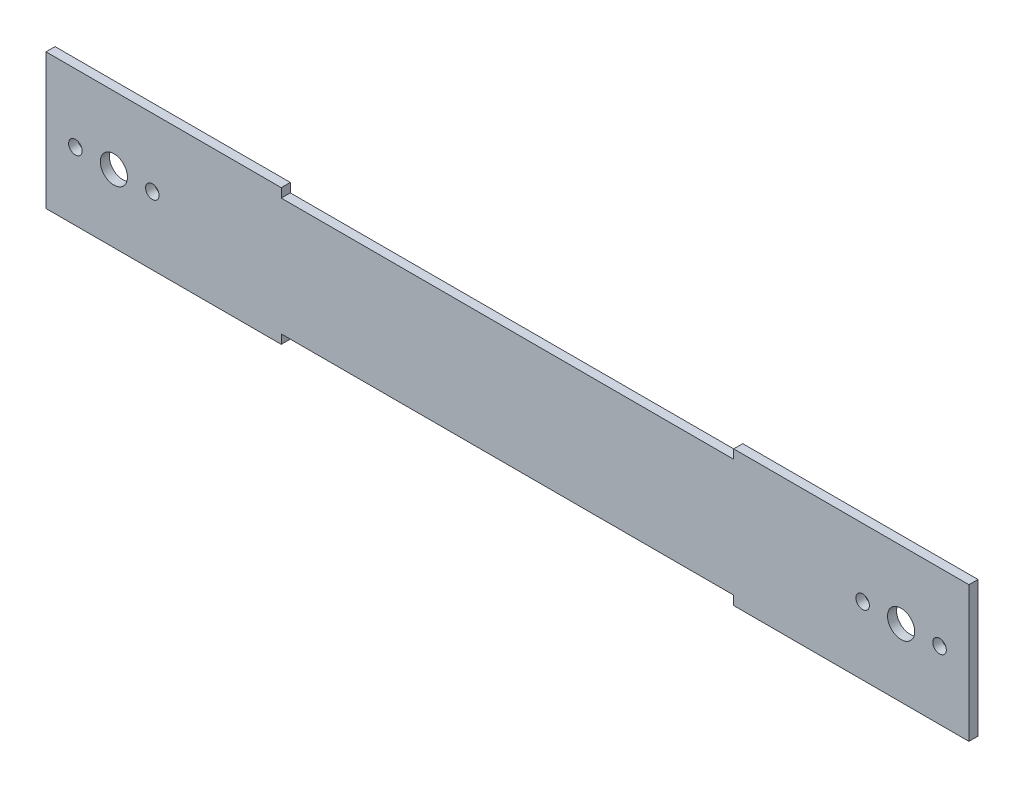
ISO-10303-21;
HEADER;
FILE_DESCRIPTION(('STEP AP214'),'2;1');
FILE_NAME('part.step','',(''),(''),'','','');
FILE_SCHEMA(('AUTOMOTIVE_DESIGN { 1 0 10303 214 1 1 1 1 }'));
ENDSEC;
DATA;
#1=APPLICATION_CONTEXT('core data for automotive mechanical design processes');
#2=APPLICATION_PROTOCOL_DEFINITION('international standard','automotive_design',2000,#1);
#3=PRODUCT_CONTEXT('',#1,'mechanical');
#4=PRODUCT('Part','Part','',(#3));
#5=PRODUCT_RELATED_PRODUCT_CATEGORY('part','',(#4));
#6=PRODUCT_DEFINITION_FORMATION('','',#4);
#7=PRODUCT_DEFINITION_CONTEXT('part definition',#1,'design');
#8=PRODUCT_DEFINITION('design','',#6,#7);
#9=PRODUCT_DEFINITION_SHAPE('','',#8);
#10=(LENGTH_UNIT() NAMED_UNIT(*) SI_UNIT(.MILLI.,.METRE.));
#11=(NAMED_UNIT(*) PLANE_ANGLE_UNIT() SI_UNIT($,.RADIAN.));
#12=(NAMED_UNIT(*) SI_UNIT($,.STERADIAN.) SOLID_ANGLE_UNIT());
#13=UNCERTAINTY_MEASURE_WITH_UNIT(LENGTH_MEASURE(1.E-05),#10,'distance_accuracy_value','');
#14=(GEOMETRIC_REPRESENTATION_CONTEXT(3) GLOBAL_UNCERTAINTY_ASSIGNED_CONTEXT((#13)) GLOBAL_UNIT_ASSIGNED_CONTEXT((#10,
#11,#12)) REPRESENTATION_CONTEXT('',''));
#15=CARTESIAN_POINT('',(0.,0.,0.));
#16=DIRECTION('',(0.,0.,1.));
#17=DIRECTION('',(1.,0.,0.));
#18=AXIS2_PLACEMENT_3D('',#15,#16,#17);
#19=CARTESIAN_POINT('',(0.,-15.,2.));
#20=DIRECTION('',(1.,0.,0.));
#21=DIRECTION('',(0.,1.,0.));
#22=AXIS2_PLACEMENT_3D('',#19,#20,#21);
#23=PLANE('',#22);
#24=DIRECTION('',(0.,-1.,0.));
#25=VECTOR('',#24,1.);
#26=CARTESIAN_POINT('',(0.,-15.,0.));
#27=LINE('',#26,#25);
#28=CARTESIAN_POINT('',(0.,15.,0.));
#29=VERTEX_POINT('',#28);
#30=CARTESIAN_POINT('',(0.,-15.,0.));
#31=VERTEX_POINT('',#30);
#32=EDGE_CURVE('E127',#29,#31,#27,.T.);
#33=ORIENTED_EDGE('',*,*,#32,.T.);
#34=DIRECTION('',(0.,0.,-1.));
#35=VECTOR('',#34,1.);
#36=CARTESIAN_POINT('',(0.,-15.,2.));
#37=LINE('',#36,#35);
#38=CARTESIAN_POINT('',(0.,-15.,2.));
#39=VERTEX_POINT('',#38);
#40=EDGE_CURVE('E11',#39,#31,#37,.T.);
#41=ORIENTED_EDGE('',*,*,#40,.F.);
#42=DIRECTION('',(0.,-1.,0.));
#43=VECTOR('',#42,1.);
#44=CARTESIAN_POINT('',(0.,-15.,2.));
#45=LINE('',#44,#43);
#46=CARTESIAN_POINT('',(0.,15.,2.));
#47=VERTEX_POINT('',#46);
#48=EDGE_CURVE('E90',#47,#39,#45,.T.);
#49=ORIENTED_EDGE('',*,*,#48,.F.);
#50=DIRECTION('',(0.,0.,-1.));
#51=VECTOR('',#50,1.);
#52=CARTESIAN_POINT('',(0.,15.,2.));
#53=LINE('',#52,#51);
#54=EDGE_CURVE('E186',#47,#29,#53,.T.);
#55=ORIENTED_EDGE('',*,*,#54,.T.);
#56=EDGE_LOOP('',(#33,#41,#49,#55));
#57=FACE_BOUND('',#56,.T.);
#58=ADVANCED_FACE('F36',(#57),#23,.F.);
#59=CARTESIAN_POINT('',(0.,-15.,2.));
#60=DIRECTION('',(0.,1.,0.));
#61=DIRECTION('',(-1.,0.,0.));
#62=AXIS2_PLACEMENT_3D('',#59,#60,#61);
#63=PLANE('',#62);
#64=DIRECTION('',(1.,0.,0.));
#65=VECTOR('',#64,1.);
#66=CARTESIAN_POINT('',(0.,-15.,0.));
#67=LINE('',#66,#65);
#68=CARTESIAN_POINT('',(52.,-15.,0.));
#69=VERTEX_POINT('',#68);
#70=EDGE_CURVE('E129',#31,#69,#67,.T.);
#71=ORIENTED_EDGE('',*,*,#70,.T.);
#72=DIRECTION('',(0.,0.,-1.));
#73=VECTOR('',#72,1.);
#74=CARTESIAN_POINT('',(52.,-15.,2.));
#75=LINE('',#74,#73);
#76=CARTESIAN_POINT('',(52.,-15.,2.));
#77=VERTEX_POINT('',#76);
#78=EDGE_CURVE('E44',#77,#69,#75,.T.);
#79=ORIENTED_EDGE('',*,*,#78,.F.);
#80=DIRECTION('',(1.,0.,0.));
#81=VECTOR('',#80,1.);
#82=CARTESIAN_POINT('',(0.,-15.,2.));
#83=LINE('',#82,#81);
#84=EDGE_CURVE('E181',#39,#77,#83,.T.);
#85=ORIENTED_EDGE('',*,*,#84,.F.);
#86=ORIENTED_EDGE('',*,*,#40,.T.);
#87=EDGE_LOOP('',(#71,#79,#85,#86));
#88=FACE_BOUND('',#87,.T.);
#89=ADVANCED_FACE('F182',(#88),#63,.F.);
#90=CARTESIAN_POINT('',(52.,-15.,2.));
#91=DIRECTION('',(-1.,0.,0.));
#92=DIRECTION('',(0.,0.,1.));
#93=AXIS2_PLACEMENT_3D('',#90,#91,#92);
#94=PLANE('',#93);
#95=DIRECTION('',(0.,1.,0.));
#96=VECTOR('',#95,1.);
#97=CARTESIAN_POINT('',(52.,-15.,0.));
#98=LINE('',#97,#96);
#99=CARTESIAN_POINT('',(52.,-13.,0.));
#100=VERTEX_POINT('',#99);
#101=EDGE_CURVE('E132',#69,#100,#98,.T.);
#102=ORIENTED_EDGE('',*,*,#101,.T.);
#103=DIRECTION('',(0.,0.,-1.));
#104=VECTOR('',#103,1.);
#105=CARTESIAN_POINT('',(52.,-13.,2.));
#106=LINE('',#105,#104);
#107=CARTESIAN_POINT('',(52.,-13.,2.));
#108=VERTEX_POINT('',#107);
#109=EDGE_CURVE('E116',#108,#100,#106,.T.);
#110=ORIENTED_EDGE('',*,*,#109,.F.);
#111=DIRECTION('',(0.,1.,0.));
#112=VECTOR('',#111,1.);
#113=CARTESIAN_POINT('',(52.,-15.,2.));
#114=LINE('',#113,#112);
#115=EDGE_CURVE('E107',#77,#108,#114,.T.);
#116=ORIENTED_EDGE('',*,*,#115,.F.);
#117=ORIENTED_EDGE('',*,*,#78,.T.);
#118=EDGE_LOOP('',(#102,#110,#116,#117));
#119=FACE_BOUND('',#118,.T.);
#120=ADVANCED_FACE('F146',(#119),#94,.F.);
#121=CARTESIAN_POINT('',(52.,-13.,2.));
#122=DIRECTION('',(0.,1.,0.));
#123=DIRECTION('',(0.,0.,1.));
#124=AXIS2_PLACEMENT_3D('',#121,#122,#123);
#125=PLANE('',#124);
#126=DIRECTION('',(1.,0.,0.));
#127=VECTOR('',#126,1.);
#128=CARTESIAN_POINT('',(52.,-13.,0.));
#129=LINE('',#128,#127);
#130=CARTESIAN_POINT('',(152.,-13.,0.));
#131=VERTEX_POINT('',#130);
#132=EDGE_CURVE('E115',#100,#131,#129,.T.);
#133=ORIENTED_EDGE('',*,*,#132,.T.);
#134=DIRECTION('',(0.,0.,-1.));
#135=VECTOR('',#134,1.);
#136=CARTESIAN_POINT('',(152.,-13.,2.));
#137=LINE('',#136,#135);
#138=CARTESIAN_POINT('',(152.,-13.,2.));
#139=VERTEX_POINT('',#138);
#140=EDGE_CURVE('E112',#139,#131,#137,.T.);
#141=ORIENTED_EDGE('',*,*,#140,.F.);
#142=DIRECTION('',(1.,0.,0.));
#143=VECTOR('',#142,1.);
#144=CARTESIAN_POINT('',(52.,-13.,2.));
#145=LINE('',#144,#143);
#146=EDGE_CURVE('E101',#108,#139,#145,.T.);
#147=ORIENTED_EDGE('',*,*,#146,.F.);
#148=ORIENTED_EDGE('',*,*,#109,.T.);
#149=EDGE_LOOP('',(#133,#141,#147,#148));
#150=FACE_BOUND('',#149,.T.);
#151=ADVANCED_FACE('F113',(#150),#125,.F.);
#152=CARTESIAN_POINT('',(152.,-13.,2.));
#153=DIRECTION('',(1.,0.,0.));
#154=DIRECTION('',(0.,0.,-1.));
#155=AXIS2_PLACEMENT_3D('',#152,#153,#154);
#156=PLANE('',#155);
#157=DIRECTION('',(0.,-1.,0.));
#158=VECTOR('',#157,1.);
#159=CARTESIAN_POINT('',(152.,-13.,0.));
#160=LINE('',#159,#158);
#161=CARTESIAN_POINT('',(152.,-15.,0.));
#162=VERTEX_POINT('',#161);
#163=EDGE_CURVE('E76',#131,#162,#160,.T.);
#164=ORIENTED_EDGE('',*,*,#163,.T.);
#165=DIRECTION('',(0.,0.,-1.));
#166=VECTOR('',#165,1.);
#167=CARTESIAN_POINT('',(152.,-15.,2.));
#168=LINE('',#167,#166);
#169=CARTESIAN_POINT('',(152.,-15.,2.));
#170=VERTEX_POINT('',#169);
#171=EDGE_CURVE('E117',#170,#162,#168,.T.);
#172=ORIENTED_EDGE('',*,*,#171,.F.);
#173=DIRECTION('',(0.,-1.,0.));
#174=VECTOR('',#173,1.);
#175=CARTESIAN_POINT('',(152.,-13.,2.));
#176=LINE('',#175,#174);
#177=EDGE_CURVE('E105',#139,#170,#176,.T.);
#178=ORIENTED_EDGE('',*,*,#177,.F.);
#179=ORIENTED_EDGE('',*,*,#140,.T.);
#180=EDGE_LOOP('',(#164,#172,#178,#179));
#181=FACE_BOUND('',#180,.T.);
#182=ADVANCED_FACE('F119',(#181),#156,.F.);
#183=CARTESIAN_POINT('',(152.,-15.,2.));
#184=DIRECTION('',(0.,1.,0.));
#185=DIRECTION('',(0.,0.,1.));
#186=AXIS2_PLACEMENT_3D('',#183,#184,#185);
#187=PLANE('',#186);
#188=DIRECTION('',(1.,0.,0.));
#189=VECTOR('',#188,1.);
#190=CARTESIAN_POINT('',(152.,-15.,0.));
#191=LINE('',#190,#189);
#192=CARTESIAN_POINT('',(204.,-15.,0.));
#193=VERTEX_POINT('',#192);
#194=EDGE_CURVE('E82',#162,#193,#191,.T.);
#195=ORIENTED_EDGE('',*,*,#194,.T.);
#196=DIRECTION('',(0.,0.,-1.));
#197=VECTOR('',#196,1.);
#198=CARTESIAN_POINT('',(204.,-15.,2.));
#199=LINE('',#198,#197);
#200=CARTESIAN_POINT('',(204.,-15.,2.));
#201=VERTEX_POINT('',#200);
#202=EDGE_CURVE('E126',#201,#193,#199,.T.);
#203=ORIENTED_EDGE('',*,*,#202,.F.);
#204=DIRECTION('',(1.,0.,0.));
#205=VECTOR('',#204,1.);
#206=CARTESIAN_POINT('',(152.,-15.,2.));
#207=LINE('',#206,#205);
#208=EDGE_CURVE('E52',#170,#201,#207,.T.);
#209=ORIENTED_EDGE('',*,*,#208,.F.);
#210=ORIENTED_EDGE('',*,*,#171,.T.);
#211=EDGE_LOOP('',(#195,#203,#209,#210));
#212=FACE_BOUND('',#211,.T.);
#213=ADVANCED_FACE('F280',(#212),#187,.F.);
#214=CARTESIAN_POINT('',(204.,0.,2.));
#215=DIRECTION('',(-1.,0.,0.));
#216=DIRECTION('',(0.,0.,1.));
#217=AXIS2_PLACEMENT_3D('',#214,#215,#216);
#218=PLANE('',#217);
#219=DIRECTION('',(0.,1.,0.));
#220=VECTOR('',#219,1.);
#221=CARTESIAN_POINT('',(204.,0.,0.));
#222=LINE('',#221,#220);
#223=CARTESIAN_POINT('',(204.,15.,0.));
#224=VERTEX_POINT('',#223);
#225=EDGE_CURVE('E137',#193,#224,#222,.T.);
#226=ORIENTED_EDGE('',*,*,#225,.T.);
#227=DIRECTION('',(0.,0.,-1.));
#228=VECTOR('',#227,1.);
#229=CARTESIAN_POINT('',(204.,15.,2.));
#230=LINE('',#229,#228);
#231=CARTESIAN_POINT('',(204.,15.,2.));
#232=VERTEX_POINT('',#231);
#233=EDGE_CURVE('E130',#232,#224,#230,.T.);
#234=ORIENTED_EDGE('',*,*,#233,.F.);
#235=DIRECTION('',(0.,1.,0.));
#236=VECTOR('',#235,1.);
#237=CARTESIAN_POINT('',(204.,0.,2.));
#238=LINE('',#237,#236);
#239=EDGE_CURVE('E121',#201,#232,#238,.T.);
#240=ORIENTED_EDGE('',*,*,#239,.F.);
#241=ORIENTED_EDGE('',*,*,#202,.T.);
#242=EDGE_LOOP('',(#226,#234,#240,#241));
#243=FACE_BOUND('',#242,.T.);
#244=ADVANCED_FACE('F162',(#243),#218,.F.);
#245=CARTESIAN_POINT('',(0.,0.,2.));
#246=DIRECTION('',(0.,0.,-1.));
#247=DIRECTION('',(-1.,0.,0.));
#248=AXIS2_PLACEMENT_3D('',#245,#246,#247);
#249=PLANE('',#248);
#250=CARTESIAN_POINT('',(6.5,0.,2.));
#251=DIRECTION('',(0.,0.,1.));
#252=DIRECTION('',(1.,0.,0.));
#253=AXIS2_PLACEMENT_3D('',#250,#251,#252);
#254=CIRCLE('',#253,1.5);
#255=CARTESIAN_POINT('',(8.,0.,2.));
#256=VERTEX_POINT('',#255);
#257=EDGE_CURVE('E388',#256,#256,#254,.T.);
#258=ORIENTED_EDGE('',*,*,#257,.F.);
#259=EDGE_LOOP('',(#258));
#260=FACE_BOUND('',#259,.T.);
#261=CARTESIAN_POINT('',(15.,0.,2.));
#262=DIRECTION('',(0.,0.,1.));
#263=DIRECTION('',(1.,0.,0.));
#264=AXIS2_PLACEMENT_3D('',#261,#262,#263);
#265=CIRCLE('',#264,3.);
#266=CARTESIAN_POINT('',(18.,0.,2.));
#267=VERTEX_POINT('',#266);
#268=EDGE_CURVE('E393',#267,#267,#265,.T.);
#269=ORIENTED_EDGE('',*,*,#268,.F.);
#270=EDGE_LOOP('',(#269));
#271=FACE_BOUND('',#270,.T.);
#272=CARTESIAN_POINT('',(23.5,0.,2.));
#273=DIRECTION('',(0.,0.,1.));
#274=DIRECTION('',(1.,0.,0.));
#275=AXIS2_PLACEMENT_3D('',#272,#273,#274);
#276=CIRCLE('',#275,1.5);
#277=CARTESIAN_POINT('',(25.,0.,2.));
#278=VERTEX_POINT('',#277);
#279=EDGE_CURVE('E401',#278,#278,#276,.T.);
#280=ORIENTED_EDGE('',*,*,#279,.F.);
#281=EDGE_LOOP('',(#280));
#282=FACE_BOUND('',#281,.T.);
#283=CARTESIAN_POINT('',(180.5,0.,2.));
#284=DIRECTION('',(0.,0.,1.));
#285=DIRECTION('',(1.,0.,0.));
#286=AXIS2_PLACEMENT_3D('',#283,#284,#285);
#287=CIRCLE('',#286,1.5);
#288=CARTESIAN_POINT('',(182.,0.,2.));
#289=VERTEX_POINT('',#288);
#290=EDGE_CURVE('E407',#289,#289,#287,.T.);
#291=ORIENTED_EDGE('',*,*,#290,.F.);
#292=EDGE_LOOP('',(#291));
#293=FACE_BOUND('',#292,.T.);
#294=CARTESIAN_POINT('',(189.,0.,2.));
#295=DIRECTION('',(0.,0.,1.));
#296=DIRECTION('',(1.,0.,0.));
#297=AXIS2_PLACEMENT_3D('',#294,#295,#296);
#298=CIRCLE('',#297,2.99999999999999);
#299=CARTESIAN_POINT('',(192.,0.,2.));
#300=VERTEX_POINT('',#299);
#301=EDGE_CURVE('E413',#300,#300,#298,.T.);
#302=ORIENTED_EDGE('',*,*,#301,.F.);
#303=EDGE_LOOP('',(#302));
#304=FACE_BOUND('',#303,.T.);
#305=CARTESIAN_POINT('',(197.5,0.,2.));
#306=DIRECTION('',(0.,0.,1.));
#307=DIRECTION('',(1.,0.,0.));
#308=AXIS2_PLACEMENT_3D('',#305,#306,#307);
#309=CIRCLE('',#308,1.5);
#310=CARTESIAN_POINT('',(199.,0.,2.));
#311=VERTEX_POINT('',#310);
#312=EDGE_CURVE('E418',#311,#311,#309,.T.);
#313=ORIENTED_EDGE('',*,*,#312,.F.);
#314=EDGE_LOOP('',(#313));
#315=FACE_BOUND('',#314,.T.);
#316=ORIENTED_EDGE('',*,*,#239,.T.);
#317=DIRECTION('',(1.,0.,0.));
#318=VECTOR('',#317,1.);
#319=CARTESIAN_POINT('',(152.,15.,2.));
#320=LINE('',#319,#318);
#321=CARTESIAN_POINT('',(152.,15.,2.));
#322=VERTEX_POINT('',#321);
#323=EDGE_CURVE('E172',#322,#232,#320,.T.);
#324=ORIENTED_EDGE('',*,*,#323,.F.);
#325=DIRECTION('',(0.,1.,0.));
#326=VECTOR('',#325,1.);
#327=CARTESIAN_POINT('',(152.,13.,2.));
#328=LINE('',#327,#326);
#329=CARTESIAN_POINT('',(152.,13.,2.));
#330=VERTEX_POINT('',#329);
#331=EDGE_CURVE('E222',#330,#322,#328,.T.);
#332=ORIENTED_EDGE('',*,*,#331,.F.);
#333=DIRECTION('',(1.,0.,0.));
#334=VECTOR('',#333,1.);
#335=CARTESIAN_POINT('',(52.,13.,2.));
#336=LINE('',#335,#334);
#337=CARTESIAN_POINT('',(52.,13.,2.));
#338=VERTEX_POINT('',#337);
#339=EDGE_CURVE('E226',#338,#330,#336,.T.);
#340=ORIENTED_EDGE('',*,*,#339,.F.);
#341=DIRECTION('',(0.,-1.,0.));
#342=VECTOR('',#341,1.);
#343=CARTESIAN_POINT('',(52.,15.,2.));
#344=LINE('',#343,#342);
#345=CARTESIAN_POINT('',(52.,15.,2.));
#346=VERTEX_POINT('',#345);
#347=EDGE_CURVE('E228',#346,#338,#344,.T.);
#348=ORIENTED_EDGE('',*,*,#347,.F.);
#349=DIRECTION('',(1.,0.,0.));
#350=VECTOR('',#349,1.);
#351=CARTESIAN_POINT('',(0.,15.,2.));
#352=LINE('',#351,#350);
#353=EDGE_CURVE('E234',#47,#346,#352,.T.);
#354=ORIENTED_EDGE('',*,*,#353,.F.);
#355=ORIENTED_EDGE('',*,*,#48,.T.);
#356=ORIENTED_EDGE('',*,*,#84,.T.);
#357=ORIENTED_EDGE('',*,*,#115,.T.);
#358=ORIENTED_EDGE('',*,*,#146,.T.);
#359=ORIENTED_EDGE('',*,*,#177,.T.);
#360=ORIENTED_EDGE('',*,*,#208,.T.);
#361=EDGE_LOOP('',(#316,#324,#332,#340,#348,#354,#355,#356,#357,#358,#359,#360));
#362=FACE_BOUND('',#361,.T.);
#363=ADVANCED_FACE('F103',(#260,#271,#282,#293,#304,#315,#362),#249,.F.);
#364=CARTESIAN_POINT('',(0.,0.,0.));
#365=DIRECTION('',(0.,0.,-1.));
#366=DIRECTION('',(-1.,0.,0.));
#367=AXIS2_PLACEMENT_3D('',#364,#365,#366);
#368=PLANE('',#367);
#369=CARTESIAN_POINT('',(6.5,0.,0.));
#370=DIRECTION('',(0.,0.,1.));
#371=DIRECTION('',(1.,0.,0.));
#372=AXIS2_PLACEMENT_3D('',#369,#370,#371);
#373=CIRCLE('',#372,1.5);
#374=CARTESIAN_POINT('',(8.,0.,0.));
#375=VERTEX_POINT('',#374);
#376=EDGE_CURVE('E238',#375,#375,#373,.T.);
#377=ORIENTED_EDGE('',*,*,#376,.T.);
#378=EDGE_LOOP('',(#377));
#379=FACE_BOUND('',#378,.T.);
#380=CARTESIAN_POINT('',(15.,0.,0.));
#381=DIRECTION('',(0.,0.,1.));
#382=DIRECTION('',(1.,0.,0.));
#383=AXIS2_PLACEMENT_3D('',#380,#381,#382);
#384=CIRCLE('',#383,3.);
#385=CARTESIAN_POINT('',(18.,0.,0.));
#386=VERTEX_POINT('',#385);
#387=EDGE_CURVE('E389',#386,#386,#384,.T.);
#388=ORIENTED_EDGE('',*,*,#387,.T.);
#389=EDGE_LOOP('',(#388));
#390=FACE_BOUND('',#389,.T.);
#391=CARTESIAN_POINT('',(23.5,0.,0.));
#392=DIRECTION('',(0.,0.,1.));
#393=DIRECTION('',(1.,0.,0.));
#394=AXIS2_PLACEMENT_3D('',#391,#392,#393);
#395=CIRCLE('',#394,1.5);
#396=CARTESIAN_POINT('',(25.,0.,0.));
#397=VERTEX_POINT('',#396);
#398=EDGE_CURVE('E398',#397,#397,#395,.T.);
#399=ORIENTED_EDGE('',*,*,#398,.T.);
#400=EDGE_LOOP('',(#399));
#401=FACE_BOUND('',#400,.T.);
#402=CARTESIAN_POINT('',(180.5,0.,0.));
#403=DIRECTION('',(0.,0.,1.));
#404=DIRECTION('',(1.,0.,0.));
#405=AXIS2_PLACEMENT_3D('',#402,#403,#404);
#406=CIRCLE('',#405,1.5);
#407=CARTESIAN_POINT('',(182.,0.,0.));
#408=VERTEX_POINT('',#407);
#409=EDGE_CURVE('E404',#408,#408,#406,.T.);
#410=ORIENTED_EDGE('',*,*,#409,.T.);
#411=EDGE_LOOP('',(#410));
#412=FACE_BOUND('',#411,.T.);
#413=CARTESIAN_POINT('',(189.,0.,0.));
#414=DIRECTION('',(0.,0.,1.));
#415=DIRECTION('',(1.,0.,0.));
#416=AXIS2_PLACEMENT_3D('',#413,#414,#415);
#417=CIRCLE('',#416,2.99999999999999);
#418=CARTESIAN_POINT('',(192.,0.,0.));
#419=VERTEX_POINT('',#418);
#420=EDGE_CURVE('E410',#419,#419,#417,.T.);
#421=ORIENTED_EDGE('',*,*,#420,.T.);
#422=EDGE_LOOP('',(#421));
#423=FACE_BOUND('',#422,.T.);
#424=CARTESIAN_POINT('',(197.5,0.,0.));
#425=DIRECTION('',(0.,0.,1.));
#426=DIRECTION('',(1.,0.,0.));
#427=AXIS2_PLACEMENT_3D('',#424,#425,#426);
#428=CIRCLE('',#427,1.5);
#429=CARTESIAN_POINT('',(199.,0.,0.));
#430=VERTEX_POINT('',#429);
#431=EDGE_CURVE('E416',#430,#430,#428,.T.);
#432=ORIENTED_EDGE('',*,*,#431,.T.);
#433=EDGE_LOOP('',(#432));
#434=FACE_BOUND('',#433,.T.);
#435=ORIENTED_EDGE('',*,*,#32,.F.);
#436=DIRECTION('',(1.,0.,0.));
#437=VECTOR('',#436,1.);
#438=CARTESIAN_POINT('',(0.,15.,0.));
#439=LINE('',#438,#437);
#440=CARTESIAN_POINT('',(52.,15.,0.));
#441=VERTEX_POINT('',#440);
#442=EDGE_CURVE('E191',#29,#441,#439,.T.);
#443=ORIENTED_EDGE('',*,*,#442,.T.);
#444=DIRECTION('',(0.,-1.,0.));
#445=VECTOR('',#444,1.);
#446=CARTESIAN_POINT('',(52.,15.,0.));
#447=LINE('',#446,#445);
#448=CARTESIAN_POINT('',(52.,13.,0.));
#449=VERTEX_POINT('',#448);
#450=EDGE_CURVE('E243',#441,#449,#447,.T.);
#451=ORIENTED_EDGE('',*,*,#450,.T.);
#452=DIRECTION('',(1.,0.,0.));
#453=VECTOR('',#452,1.);
#454=CARTESIAN_POINT('',(52.,13.,0.));
#455=LINE('',#454,#453);
#456=CARTESIAN_POINT('',(152.,13.,0.));
#457=VERTEX_POINT('',#456);
#458=EDGE_CURVE('E240',#449,#457,#455,.T.);
#459=ORIENTED_EDGE('',*,*,#458,.T.);
#460=DIRECTION('',(0.,1.,0.));
#461=VECTOR('',#460,1.);
#462=CARTESIAN_POINT('',(152.,13.,0.));
#463=LINE('',#462,#461);
#464=CARTESIAN_POINT('',(152.,15.,0.));
#465=VERTEX_POINT('',#464);
#466=EDGE_CURVE('E237',#457,#465,#463,.T.);
#467=ORIENTED_EDGE('',*,*,#466,.T.);
#468=DIRECTION('',(1.,0.,0.));
#469=VECTOR('',#468,1.);
#470=CARTESIAN_POINT('',(152.,15.,0.));
#471=LINE('',#470,#469);
#472=EDGE_CURVE('E158',#465,#224,#471,.T.);
#473=ORIENTED_EDGE('',*,*,#472,.T.);
#474=ORIENTED_EDGE('',*,*,#225,.F.);
#475=ORIENTED_EDGE('',*,*,#194,.F.);
#476=ORIENTED_EDGE('',*,*,#163,.F.);
#477=ORIENTED_EDGE('',*,*,#132,.F.);
#478=ORIENTED_EDGE('',*,*,#101,.F.);
#479=ORIENTED_EDGE('',*,*,#70,.F.);
#480=EDGE_LOOP('',(#435,#443,#451,#459,#467,#473,#474,#475,#476,#477,#478,#479));
#481=FACE_BOUND('',#480,.T.);
#482=ADVANCED_FACE('F152',(#379,#390,#401,#412,#423,#434,#481),#368,.T.);
#483=CARTESIAN_POINT('',(152.,15.,2.));
#484=DIRECTION('',(0.,1.,0.));
#485=DIRECTION('',(0.,0.,1.));
#486=AXIS2_PLACEMENT_3D('',#483,#484,#485);
#487=PLANE('',#486);
#488=ORIENTED_EDGE('',*,*,#472,.F.);
#489=DIRECTION('',(0.,0.,-1.));
#490=VECTOR('',#489,1.);
#491=CARTESIAN_POINT('',(152.,15.,2.));
#492=LINE('',#491,#490);
#493=EDGE_CURVE('E173',#322,#465,#492,.T.);
#494=ORIENTED_EDGE('',*,*,#493,.F.);
#495=ORIENTED_EDGE('',*,*,#323,.T.);
#496=ORIENTED_EDGE('',*,*,#233,.T.);
#497=EDGE_LOOP('',(#488,#494,#495,#496));
#498=FACE_BOUND('',#497,.T.);
#499=ADVANCED_FACE('F169',(#498),#487,.T.);
#500=CARTESIAN_POINT('',(152.,13.,2.));
#501=DIRECTION('',(-1.,0.,0.));
#502=DIRECTION('',(0.,0.,1.));
#503=AXIS2_PLACEMENT_3D('',#500,#501,#502);
#504=PLANE('',#503);
#505=ORIENTED_EDGE('',*,*,#466,.F.);
#506=DIRECTION('',(0.,0.,-1.));
#507=VECTOR('',#506,1.);
#508=CARTESIAN_POINT('',(152.,13.,2.));
#509=LINE('',#508,#507);
#510=EDGE_CURVE('E176',#330,#457,#509,.T.);
#511=ORIENTED_EDGE('',*,*,#510,.F.);
#512=ORIENTED_EDGE('',*,*,#331,.T.);
#513=ORIENTED_EDGE('',*,*,#493,.T.);
#514=EDGE_LOOP('',(#505,#511,#512,#513));
#515=FACE_BOUND('',#514,.T.);
#516=ADVANCED_FACE('F225',(#515),#504,.T.);
#517=CARTESIAN_POINT('',(52.,13.,2.));
#518=DIRECTION('',(0.,1.,0.));
#519=DIRECTION('',(0.,0.,1.));
#520=AXIS2_PLACEMENT_3D('',#517,#518,#519);
#521=PLANE('',#520);
#522=ORIENTED_EDGE('',*,*,#458,.F.);
#523=DIRECTION('',(0.,0.,-1.));
#524=VECTOR('',#523,1.);
#525=CARTESIAN_POINT('',(52.,13.,2.));
#526=LINE('',#525,#524);
#527=EDGE_CURVE('E248',#338,#449,#526,.T.);
#528=ORIENTED_EDGE('',*,*,#527,.F.);
#529=ORIENTED_EDGE('',*,*,#339,.T.);
#530=ORIENTED_EDGE('',*,*,#510,.T.);
#531=EDGE_LOOP('',(#522,#528,#529,#530));
#532=FACE_BOUND('',#531,.T.);
#533=ADVANCED_FACE('F251',(#532),#521,.T.);
#534=CARTESIAN_POINT('',(52.,15.,2.));
#535=DIRECTION('',(1.,0.,0.));
#536=DIRECTION('',(0.,0.,-1.));
#537=AXIS2_PLACEMENT_3D('',#534,#535,#536);
#538=PLANE('',#537);
#539=ORIENTED_EDGE('',*,*,#450,.F.);
#540=DIRECTION('',(0.,0.,-1.));
#541=VECTOR('',#540,1.);
#542=CARTESIAN_POINT('',(52.,15.,2.));
#543=LINE('',#542,#541);
#544=EDGE_CURVE('E199',#346,#441,#543,.T.);
#545=ORIENTED_EDGE('',*,*,#544,.F.);
#546=ORIENTED_EDGE('',*,*,#347,.T.);
#547=ORIENTED_EDGE('',*,*,#527,.T.);
#548=EDGE_LOOP('',(#539,#545,#546,#547));
#549=FACE_BOUND('',#548,.T.);
#550=ADVANCED_FACE('F253',(#549),#538,.T.);
#551=CARTESIAN_POINT('',(0.,15.,2.));
#552=DIRECTION('',(0.,1.,0.));
#553=DIRECTION('',(-1.,0.,0.));
#554=AXIS2_PLACEMENT_3D('',#551,#552,#553);
#555=PLANE('',#554);
#556=ORIENTED_EDGE('',*,*,#442,.F.);
#557=ORIENTED_EDGE('',*,*,#54,.F.);
#558=ORIENTED_EDGE('',*,*,#353,.T.);
#559=ORIENTED_EDGE('',*,*,#544,.T.);
#560=EDGE_LOOP('',(#556,#557,#558,#559));
#561=FACE_BOUND('',#560,.T.);
#562=ADVANCED_FACE('F255',(#561),#555,.T.);
#563=CARTESIAN_POINT('',(197.5,0.,0.));
#564=DIRECTION('',(0.,0.,1.));
#565=DIRECTION('',(1.,0.,0.));
#566=AXIS2_PLACEMENT_3D('',#563,#564,#565);
#567=CYLINDRICAL_SURFACE('',#566,1.5);
#568=ORIENTED_EDGE('',*,*,#431,.F.);
#569=EDGE_LOOP('',(#568));
#570=FACE_BOUND('',#569,.T.);
#571=ORIENTED_EDGE('',*,*,#312,.T.);
#572=EDGE_LOOP('',(#571));
#573=FACE_BOUND('',#572,.T.);
#574=ADVANCED_FACE('F257',(#570,#573),#567,.F.);
#575=CARTESIAN_POINT('',(189.,0.,0.));
#576=DIRECTION('',(0.,0.,1.));
#577=DIRECTION('',(1.,0.,0.));
#578=AXIS2_PLACEMENT_3D('',#575,#576,#577);
#579=CYLINDRICAL_SURFACE('',#578,2.99999999999999);
#580=ORIENTED_EDGE('',*,*,#420,.F.);
#581=EDGE_LOOP('',(#580));
#582=FACE_BOUND('',#581,.T.);
#583=ORIENTED_EDGE('',*,*,#301,.T.);
#584=EDGE_LOOP('',(#583));
#585=FACE_BOUND('',#584,.T.);
#586=ADVANCED_FACE('F263',(#582,#585),#579,.F.);
#587=CARTESIAN_POINT('',(180.5,0.,0.));
#588=DIRECTION('',(0.,0.,1.));
#589=DIRECTION('',(1.,0.,0.));
#590=AXIS2_PLACEMENT_3D('',#587,#588,#589);
#591=CYLINDRICAL_SURFACE('',#590,1.5);
#592=ORIENTED_EDGE('',*,*,#409,.F.);
#593=EDGE_LOOP('',(#592));
#594=FACE_BOUND('',#593,.T.);
#595=ORIENTED_EDGE('',*,*,#290,.T.);
#596=EDGE_LOOP('',(#595));
#597=FACE_BOUND('',#596,.T.);
#598=ADVANCED_FACE('F339',(#594,#597),#591,.F.);
#599=CARTESIAN_POINT('',(23.5,0.,0.));
#600=DIRECTION('',(0.,0.,1.));
#601=DIRECTION('',(1.,0.,0.));
#602=AXIS2_PLACEMENT_3D('',#599,#600,#601);
#603=CYLINDRICAL_SURFACE('',#602,1.5);
#604=ORIENTED_EDGE('',*,*,#398,.F.);
#605=EDGE_LOOP('',(#604));
#606=FACE_BOUND('',#605,.T.);
#607=ORIENTED_EDGE('',*,*,#279,.T.);
#608=EDGE_LOOP('',(#607));
#609=FACE_BOUND('',#608,.T.);
#610=ADVANCED_FACE('F349',(#606,#609),#603,.F.);
#611=CARTESIAN_POINT('',(15.,0.,0.));
#612=DIRECTION('',(0.,0.,1.));
#613=DIRECTION('',(1.,0.,0.));
#614=AXIS2_PLACEMENT_3D('',#611,#612,#613);
#615=CYLINDRICAL_SURFACE('',#614,3.);
#616=ORIENTED_EDGE('',*,*,#387,.F.);
#617=EDGE_LOOP('',(#616));
#618=FACE_BOUND('',#617,.T.);
#619=ORIENTED_EDGE('',*,*,#268,.T.);
#620=EDGE_LOOP('',(#619));
#621=FACE_BOUND('',#620,.T.);
#622=ADVANCED_FACE('F359',(#618,#621),#615,.F.);
#623=CARTESIAN_POINT('',(6.5,0.,0.));
#624=DIRECTION('',(0.,0.,1.));
#625=DIRECTION('',(1.,0.,0.));
#626=AXIS2_PLACEMENT_3D('',#623,#624,#625);
#627=CYLINDRICAL_SURFACE('',#626,1.5);
#628=ORIENTED_EDGE('',*,*,#376,.F.);
#629=EDGE_LOOP('',(#628));
#630=FACE_BOUND('',#629,.T.);
#631=ORIENTED_EDGE('',*,*,#257,.T.);
#632=EDGE_LOOP('',(#631));
#633=FACE_BOUND('',#632,.T.);
#634=ADVANCED_FACE('F369',(#630,#633),#627,.F.);
#635=CLOSED_SHELL('',(#58,#89,#120,#151,#182,#213,#244,#363,#482,#499,#516,#533,#550,#562,#574,
#586,#598,#610,#622,#634));
#636=MANIFOLD_SOLID_BREP('B2',#635);
#637=ADVANCED_BREP_SHAPE_REPRESENTATION('',(#18,#636),#14);
#638=SHAPE_DEFINITION_REPRESENTATION(#9,#637);
ENDSEC;
END-ISO-10303-21;
